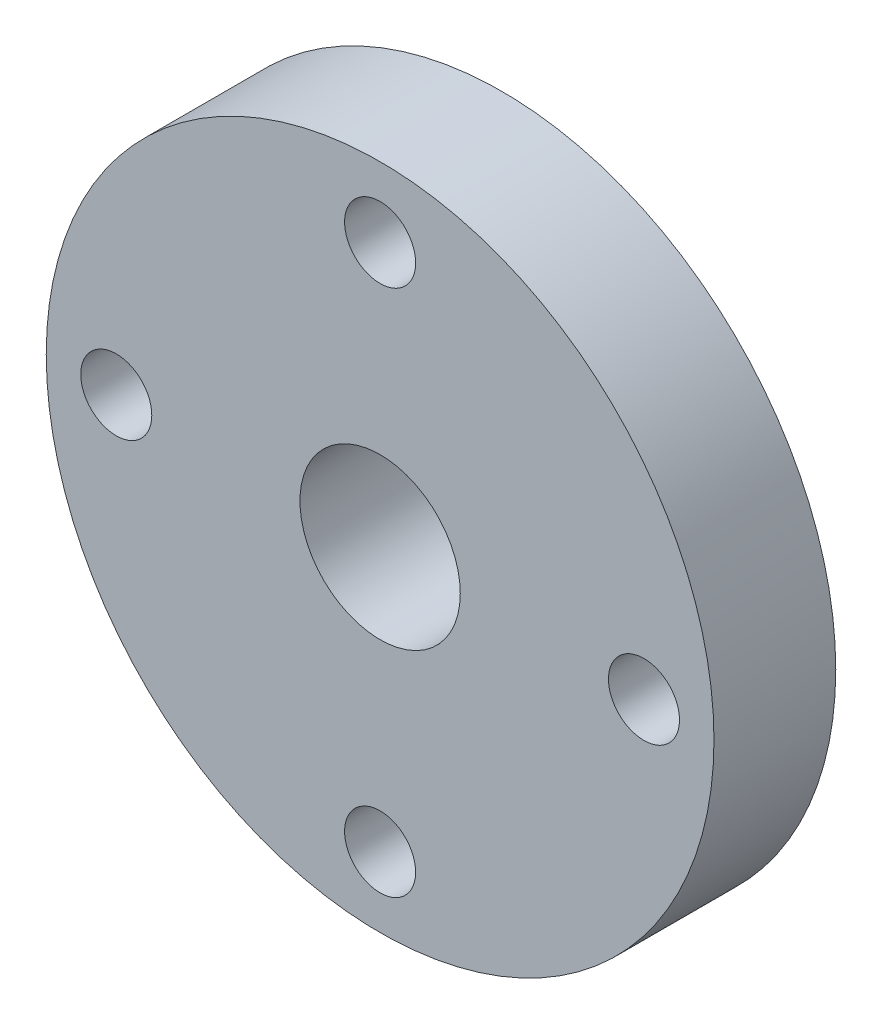
ISO-10303-21;
HEADER;
FILE_DESCRIPTION(('STEP AP214'),'2;1');
FILE_NAME('part.step','',(''),(''),'','','');
FILE_SCHEMA(('AUTOMOTIVE_DESIGN { 1 0 10303 214 1 1 1 1 }'));
ENDSEC;
DATA;
#1=APPLICATION_CONTEXT('core data for automotive mechanical design processes');
#2=APPLICATION_PROTOCOL_DEFINITION('international standard','automotive_design',2000,#1);
#3=PRODUCT_CONTEXT('',#1,'mechanical');
#4=PRODUCT('Part','Part','',(#3));
#5=PRODUCT_RELATED_PRODUCT_CATEGORY('part','',(#4));
#6=PRODUCT_DEFINITION_FORMATION('','',#4);
#7=PRODUCT_DEFINITION_CONTEXT('part definition',#1,'design');
#8=PRODUCT_DEFINITION('design','',#6,#7);
#9=PRODUCT_DEFINITION_SHAPE('','',#8);
#10=(LENGTH_UNIT() NAMED_UNIT(*) SI_UNIT(.MILLI.,.METRE.));
#11=(NAMED_UNIT(*) PLANE_ANGLE_UNIT() SI_UNIT($,.RADIAN.));
#12=(NAMED_UNIT(*) SI_UNIT($,.STERADIAN.) SOLID_ANGLE_UNIT());
#13=UNCERTAINTY_MEASURE_WITH_UNIT(LENGTH_MEASURE(1.E-05),#10,'distance_accuracy_value','');
#14=(GEOMETRIC_REPRESENTATION_CONTEXT(3) GLOBAL_UNCERTAINTY_ASSIGNED_CONTEXT((#13)) GLOBAL_UNIT_ASSIGNED_CONTEXT((#10,
#11,#12)) REPRESENTATION_CONTEXT('',''));
#15=CARTESIAN_POINT('',(0.,0.,0.));
#16=DIRECTION('',(0.,0.,1.));
#17=DIRECTION('',(1.,0.,0.));
#18=AXIS2_PLACEMENT_3D('',#15,#16,#17);
#19=CARTESIAN_POINT('',(0.,0.,6.));
#20=DIRECTION('',(0.,0.,1.));
#21=DIRECTION('',(1.,0.,0.));
#22=AXIS2_PLACEMENT_3D('',#19,#20,#21);
#23=PLANE('',#22);
#24=CARTESIAN_POINT('',(0.,-13.,6.));
#25=DIRECTION('',(0.,0.,1.));
#26=DIRECTION('',(1.,0.,0.));
#27=AXIS2_PLACEMENT_3D('',#24,#25,#26);
#28=CIRCLE('',#27,1.75);
#29=CARTESIAN_POINT('',(1.75,-13.,6.));
#30=VERTEX_POINT('',#29);
#31=EDGE_CURVE('E55',#30,#30,#28,.T.);
#32=ORIENTED_EDGE('',*,*,#31,.F.);
#33=EDGE_LOOP('',(#32));
#34=FACE_BOUND('',#33,.T.);
#35=CARTESIAN_POINT('',(0.,13.,6.));
#36=DIRECTION('',(0.,0.,1.));
#37=DIRECTION('',(1.,0.,0.));
#38=AXIS2_PLACEMENT_3D('',#35,#36,#37);
#39=CIRCLE('',#38,1.75);
#40=CARTESIAN_POINT('',(1.75,13.,6.));
#41=VERTEX_POINT('',#40);
#42=EDGE_CURVE('E48',#41,#41,#39,.T.);
#43=ORIENTED_EDGE('',*,*,#42,.F.);
#44=EDGE_LOOP('',(#43));
#45=FACE_BOUND('',#44,.T.);
#46=CARTESIAN_POINT('',(0.,0.,6.));
#47=DIRECTION('',(0.,0.,1.));
#48=DIRECTION('',(1.,0.,0.));
#49=AXIS2_PLACEMENT_3D('',#46,#47,#48);
#50=CIRCLE('',#49,16.45);
#51=CARTESIAN_POINT('',(16.45,0.,6.));
#52=VERTEX_POINT('',#51);
#53=EDGE_CURVE('E11',#52,#52,#50,.T.);
#54=ORIENTED_EDGE('',*,*,#53,.T.);
#55=EDGE_LOOP('',(#54));
#56=FACE_BOUND('',#55,.T.);
#57=CARTESIAN_POINT('',(0.,0.,6.));
#58=DIRECTION('',(0.,0.,1.));
#59=DIRECTION('',(1.,0.,0.));
#60=AXIS2_PLACEMENT_3D('',#57,#58,#59);
#61=CIRCLE('',#60,3.95);
#62=CARTESIAN_POINT('',(3.95,0.,6.));
#63=VERTEX_POINT('',#62);
#64=EDGE_CURVE('E43',#63,#63,#61,.T.);
#65=ORIENTED_EDGE('',*,*,#64,.F.);
#66=EDGE_LOOP('',(#65));
#67=FACE_BOUND('',#66,.T.);
#68=CARTESIAN_POINT('',(13.,0.,6.));
#69=DIRECTION('',(0.,0.,1.));
#70=DIRECTION('',(1.,0.,0.));
#71=AXIS2_PLACEMENT_3D('',#68,#69,#70);
#72=CIRCLE('',#71,1.75);
#73=CARTESIAN_POINT('',(14.75,0.,6.));
#74=VERTEX_POINT('',#73);
#75=EDGE_CURVE('E54',#74,#74,#72,.T.);
#76=ORIENTED_EDGE('',*,*,#75,.F.);
#77=EDGE_LOOP('',(#76));
#78=FACE_BOUND('',#77,.T.);
#79=CARTESIAN_POINT('',(-13.,0.,6.));
#80=DIRECTION('',(0.,0.,1.));
#81=DIRECTION('',(1.,0.,0.));
#82=AXIS2_PLACEMENT_3D('',#79,#80,#81);
#83=CIRCLE('',#82,1.75);
#84=CARTESIAN_POINT('',(-11.25,0.,6.));
#85=VERTEX_POINT('',#84);
#86=EDGE_CURVE('E62',#85,#85,#83,.T.);
#87=ORIENTED_EDGE('',*,*,#86,.F.);
#88=EDGE_LOOP('',(#87));
#89=FACE_BOUND('',#88,.T.);
#90=ADVANCED_FACE('F32',(#34,#45,#56,#67,#78,#89),#23,.T.);
#91=CARTESIAN_POINT('',(0.,0.,0.));
#92=DIRECTION('',(0.,0.,1.));
#93=DIRECTION('',(1.,0.,0.));
#94=AXIS2_PLACEMENT_3D('',#91,#92,#93);
#95=PLANE('',#94);
#96=CARTESIAN_POINT('',(0.,-13.,0.));
#97=DIRECTION('',(0.,0.,1.));
#98=DIRECTION('',(1.,0.,0.));
#99=AXIS2_PLACEMENT_3D('',#96,#97,#98);
#100=CIRCLE('',#99,1.75);
#101=CARTESIAN_POINT('',(1.75,-13.,0.));
#102=VERTEX_POINT('',#101);
#103=EDGE_CURVE('E59',#102,#102,#100,.T.);
#104=ORIENTED_EDGE('',*,*,#103,.T.);
#105=EDGE_LOOP('',(#104));
#106=FACE_BOUND('',#105,.T.);
#107=CARTESIAN_POINT('',(0.,13.,0.));
#108=DIRECTION('',(0.,0.,1.));
#109=DIRECTION('',(1.,0.,0.));
#110=AXIS2_PLACEMENT_3D('',#107,#108,#109);
#111=CIRCLE('',#110,1.75);
#112=CARTESIAN_POINT('',(1.75,13.,0.));
#113=VERTEX_POINT('',#112);
#114=EDGE_CURVE('E58',#113,#113,#111,.T.);
#115=ORIENTED_EDGE('',*,*,#114,.T.);
#116=EDGE_LOOP('',(#115));
#117=FACE_BOUND('',#116,.T.);
#118=CARTESIAN_POINT('',(0.,0.,0.));
#119=DIRECTION('',(0.,0.,1.));
#120=DIRECTION('',(1.,0.,0.));
#121=AXIS2_PLACEMENT_3D('',#118,#119,#120);
#122=CIRCLE('',#121,16.45);
#123=CARTESIAN_POINT('',(16.45,0.,0.));
#124=VERTEX_POINT('',#123);
#125=EDGE_CURVE('E36',#124,#124,#122,.T.);
#126=ORIENTED_EDGE('',*,*,#125,.F.);
#127=EDGE_LOOP('',(#126));
#128=FACE_BOUND('',#127,.T.);
#129=CARTESIAN_POINT('',(0.,0.,0.));
#130=DIRECTION('',(0.,0.,1.));
#131=DIRECTION('',(1.,0.,0.));
#132=AXIS2_PLACEMENT_3D('',#129,#130,#131);
#133=CIRCLE('',#132,3.95);
#134=CARTESIAN_POINT('',(3.95,0.,0.));
#135=VERTEX_POINT('',#134);
#136=EDGE_CURVE('E45',#135,#135,#133,.T.);
#137=ORIENTED_EDGE('',*,*,#136,.T.);
#138=EDGE_LOOP('',(#137));
#139=FACE_BOUND('',#138,.T.);
#140=CARTESIAN_POINT('',(13.,0.,0.));
#141=DIRECTION('',(0.,0.,1.));
#142=DIRECTION('',(1.,0.,0.));
#143=AXIS2_PLACEMENT_3D('',#140,#141,#142);
#144=CIRCLE('',#143,1.75);
#145=CARTESIAN_POINT('',(14.75,0.,0.));
#146=VERTEX_POINT('',#145);
#147=EDGE_CURVE('E51',#146,#146,#144,.T.);
#148=ORIENTED_EDGE('',*,*,#147,.T.);
#149=EDGE_LOOP('',(#148));
#150=FACE_BOUND('',#149,.T.);
#151=CARTESIAN_POINT('',(-13.,0.,0.));
#152=DIRECTION('',(0.,0.,1.));
#153=DIRECTION('',(1.,0.,0.));
#154=AXIS2_PLACEMENT_3D('',#151,#152,#153);
#155=CIRCLE('',#154,1.75);
#156=CARTESIAN_POINT('',(-11.25,0.,0.));
#157=VERTEX_POINT('',#156);
#158=EDGE_CURVE('E65',#157,#157,#155,.T.);
#159=ORIENTED_EDGE('',*,*,#158,.T.);
#160=EDGE_LOOP('',(#159));
#161=FACE_BOUND('',#160,.T.);
#162=ADVANCED_FACE('F79',(#106,#117,#128,#139,#150,#161),#95,.F.);
#163=CARTESIAN_POINT('',(0.,0.,6.));
#164=DIRECTION('',(0.,0.,-1.));
#165=DIRECTION('',(-1.,0.,0.));
#166=AXIS2_PLACEMENT_3D('',#163,#164,#165);
#167=CYLINDRICAL_SURFACE('',#166,16.45);
#168=ORIENTED_EDGE('',*,*,#53,.F.);
#169=EDGE_LOOP('',(#168));
#170=FACE_BOUND('',#169,.T.);
#171=ORIENTED_EDGE('',*,*,#125,.T.);
#172=EDGE_LOOP('',(#171));
#173=FACE_BOUND('',#172,.T.);
#174=ADVANCED_FACE('F95',(#170,#173),#167,.T.);
#175=CARTESIAN_POINT('',(0.,0.,6.));
#176=DIRECTION('',(0.,0.,-1.));
#177=DIRECTION('',(-1.,0.,0.));
#178=AXIS2_PLACEMENT_3D('',#175,#176,#177);
#179=CYLINDRICAL_SURFACE('',#178,3.95);
#180=ORIENTED_EDGE('',*,*,#64,.T.);
#181=EDGE_LOOP('',(#180));
#182=FACE_BOUND('',#181,.T.);
#183=ORIENTED_EDGE('',*,*,#136,.F.);
#184=EDGE_LOOP('',(#183));
#185=FACE_BOUND('',#184,.T.);
#186=ADVANCED_FACE('F101',(#182,#185),#179,.F.);
#187=CARTESIAN_POINT('',(0.,13.,6.));
#188=DIRECTION('',(0.,0.,-1.));
#189=DIRECTION('',(-1.,0.,0.));
#190=AXIS2_PLACEMENT_3D('',#187,#188,#189);
#191=CYLINDRICAL_SURFACE('',#190,1.75);
#192=ORIENTED_EDGE('',*,*,#42,.T.);
#193=EDGE_LOOP('',(#192));
#194=FACE_BOUND('',#193,.T.);
#195=ORIENTED_EDGE('',*,*,#114,.F.);
#196=EDGE_LOOP('',(#195));
#197=FACE_BOUND('',#196,.T.);
#198=ADVANCED_FACE('F75',(#194,#197),#191,.F.);
#199=CARTESIAN_POINT('',(13.,0.,6.));
#200=DIRECTION('',(0.,0.,-1.));
#201=DIRECTION('',(-1.,0.,0.));
#202=AXIS2_PLACEMENT_3D('',#199,#200,#201);
#203=CYLINDRICAL_SURFACE('',#202,1.75);
#204=ORIENTED_EDGE('',*,*,#75,.T.);
#205=EDGE_LOOP('',(#204));
#206=FACE_BOUND('',#205,.T.);
#207=ORIENTED_EDGE('',*,*,#147,.F.);
#208=EDGE_LOOP('',(#207));
#209=FACE_BOUND('',#208,.T.);
#210=ADVANCED_FACE('F107',(#206,#209),#203,.F.);
#211=CARTESIAN_POINT('',(0.,-13.,6.));
#212=DIRECTION('',(0.,0.,-1.));
#213=DIRECTION('',(-1.,0.,0.));
#214=AXIS2_PLACEMENT_3D('',#211,#212,#213);
#215=CYLINDRICAL_SURFACE('',#214,1.75);
#216=ORIENTED_EDGE('',*,*,#31,.T.);
#217=EDGE_LOOP('',(#216));
#218=FACE_BOUND('',#217,.T.);
#219=ORIENTED_EDGE('',*,*,#103,.F.);
#220=EDGE_LOOP('',(#219));
#221=FACE_BOUND('',#220,.T.);
#222=ADVANCED_FACE('F91',(#218,#221),#215,.F.);
#223=CARTESIAN_POINT('',(-13.,0.,6.));
#224=DIRECTION('',(0.,0.,-1.));
#225=DIRECTION('',(-1.,0.,0.));
#226=AXIS2_PLACEMENT_3D('',#223,#224,#225);
#227=CYLINDRICAL_SURFACE('',#226,1.75);
#228=ORIENTED_EDGE('',*,*,#86,.T.);
#229=EDGE_LOOP('',(#228));
#230=FACE_BOUND('',#229,.T.);
#231=ORIENTED_EDGE('',*,*,#158,.F.);
#232=EDGE_LOOP('',(#231));
#233=FACE_BOUND('',#232,.T.);
#234=ADVANCED_FACE('F34',(#230,#233),#227,.F.);
#235=CLOSED_SHELL('',(#90,#162,#174,#186,#198,#210,#222,#234));
#236=MANIFOLD_SOLID_BREP('B2',#235);
#237=ADVANCED_BREP_SHAPE_REPRESENTATION('',(#18,#236),#14);
#238=SHAPE_DEFINITION_REPRESENTATION(#9,#237);
ENDSEC;
END-ISO-10303-21;
